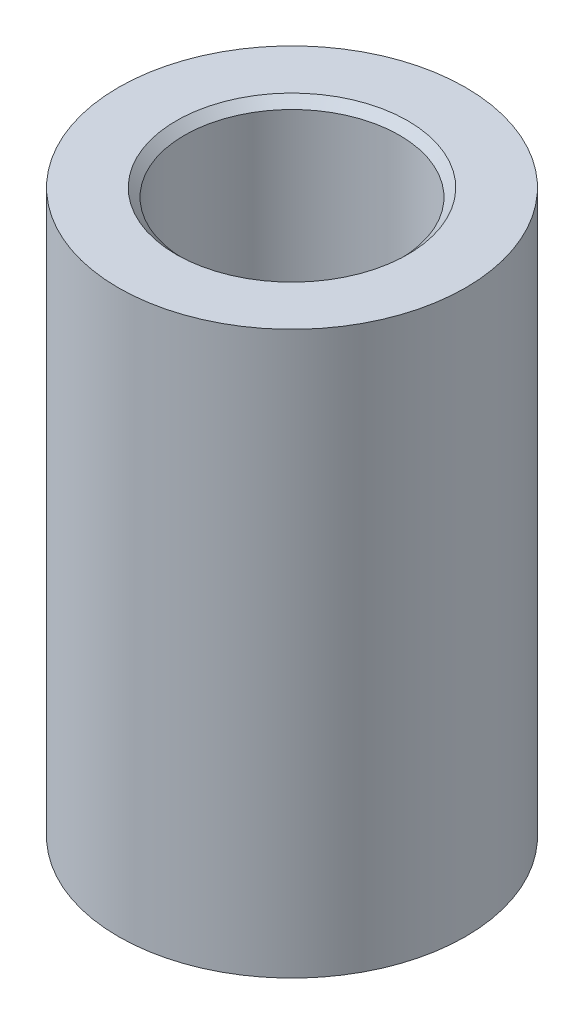
ISO-10303-21;
HEADER;
FILE_DESCRIPTION(('STEP AP214'),'2;1');
FILE_NAME('part.step','',(''),(''),'','','');
FILE_SCHEMA(('AUTOMOTIVE_DESIGN { 1 0 10303 214 1 1 1 1 }'));
ENDSEC;
DATA;
#1=APPLICATION_CONTEXT('core data for automotive mechanical design processes');
#2=APPLICATION_PROTOCOL_DEFINITION('international standard','automotive_design',2000,#1);
#3=PRODUCT_CONTEXT('',#1,'mechanical');
#4=PRODUCT('Part','Part','',(#3));
#5=PRODUCT_RELATED_PRODUCT_CATEGORY('part','',(#4));
#6=PRODUCT_DEFINITION_FORMATION('','',#4);
#7=PRODUCT_DEFINITION_CONTEXT('part definition',#1,'design');
#8=PRODUCT_DEFINITION('design','',#6,#7);
#9=PRODUCT_DEFINITION_SHAPE('','',#8);
#10=(LENGTH_UNIT() NAMED_UNIT(*) SI_UNIT(.MILLI.,.METRE.));
#11=(NAMED_UNIT(*) PLANE_ANGLE_UNIT() SI_UNIT($,.RADIAN.));
#12=(NAMED_UNIT(*) SI_UNIT($,.STERADIAN.) SOLID_ANGLE_UNIT());
#13=UNCERTAINTY_MEASURE_WITH_UNIT(LENGTH_MEASURE(1.E-05),#10,'distance_accuracy_value','');
#14=(GEOMETRIC_REPRESENTATION_CONTEXT(3) GLOBAL_UNCERTAINTY_ASSIGNED_CONTEXT((#13)) GLOBAL_UNIT_ASSIGNED_CONTEXT((#10,
#11,#12)) REPRESENTATION_CONTEXT('',''));
#15=CARTESIAN_POINT('',(0.,0.,0.));
#16=DIRECTION('',(0.,0.,1.));
#17=DIRECTION('',(1.,0.,0.));
#18=AXIS2_PLACEMENT_3D('',#15,#16,#17);
#19=CARTESIAN_POINT('',(0.,26.9875,0.));
#20=DIRECTION('',(0.,1.,0.));
#21=DIRECTION('',(0.,0.,1.));
#22=AXIS2_PLACEMENT_3D('',#19,#20,#21);
#23=PLANE('',#22);
#24=CARTESIAN_POINT('',(0.,26.9875,0.));
#25=DIRECTION('',(0.,1.,0.));
#26=DIRECTION('',(0.,0.,1.));
#27=AXIS2_PLACEMENT_3D('',#24,#25,#26);
#28=CIRCLE('',#27,5.56250000000001);
#29=CARTESIAN_POINT('',(0.,26.9875,5.56250000000001));
#30=VERTEX_POINT('',#29);
#31=EDGE_CURVE('E10',#30,#30,#28,.F.);
#32=ORIENTED_EDGE('',*,*,#31,.T.);
#33=EDGE_LOOP('',(#32));
#34=FACE_BOUND('',#33,.T.);
#35=CARTESIAN_POINT('',(0.,26.9875,0.));
#36=DIRECTION('',(0.,1.,0.));
#37=DIRECTION('',(0.,0.,1.));
#38=AXIS2_PLACEMENT_3D('',#35,#36,#37);
#39=CIRCLE('',#38,8.3375);
#40=CARTESIAN_POINT('',(0.,26.9875,8.3375));
#41=VERTEX_POINT('',#40);
#42=EDGE_CURVE('E51',#41,#41,#39,.T.);
#43=ORIENTED_EDGE('',*,*,#42,.T.);
#44=EDGE_LOOP('',(#43));
#45=FACE_BOUND('',#44,.T.);
#46=ADVANCED_FACE('F31',(#34,#45),#23,.T.);
#47=CARTESIAN_POINT('',(0.,0.,0.));
#48=DIRECTION('',(0.,1.,0.));
#49=DIRECTION('',(0.,0.,1.));
#50=AXIS2_PLACEMENT_3D('',#47,#48,#49);
#51=PLANE('',#50);
#52=CARTESIAN_POINT('',(0.,0.,0.));
#53=DIRECTION('',(0.,1.,0.));
#54=DIRECTION('',(0.,0.,1.));
#55=AXIS2_PLACEMENT_3D('',#52,#53,#54);
#56=CIRCLE('',#55,5.5625);
#57=CARTESIAN_POINT('',(0.,0.,5.5625));
#58=VERTEX_POINT('',#57);
#59=EDGE_CURVE('E46',#58,#58,#56,.T.);
#60=ORIENTED_EDGE('',*,*,#59,.T.);
#61=EDGE_LOOP('',(#60));
#62=FACE_BOUND('',#61,.T.);
#63=CARTESIAN_POINT('',(0.,0.,0.));
#64=DIRECTION('',(0.,1.,0.));
#65=DIRECTION('',(0.,0.,1.));
#66=AXIS2_PLACEMENT_3D('',#63,#64,#65);
#67=CIRCLE('',#66,8.3375);
#68=CARTESIAN_POINT('',(0.,0.,8.3375));
#69=VERTEX_POINT('',#68);
#70=EDGE_CURVE('E52',#69,#69,#67,.T.);
#71=ORIENTED_EDGE('',*,*,#70,.F.);
#72=EDGE_LOOP('',(#71));
#73=FACE_BOUND('',#72,.T.);
#74=ADVANCED_FACE('F63',(#62,#73),#51,.F.);
#75=CARTESIAN_POINT('',(0.,26.9875,0.));
#76=DIRECTION('',(0.,-1.,0.));
#77=DIRECTION('',(0.,0.,-1.));
#78=AXIS2_PLACEMENT_3D('',#75,#76,#77);
#79=CYLINDRICAL_SURFACE('',#78,8.3375);
#80=ORIENTED_EDGE('',*,*,#42,.F.);
#81=EDGE_LOOP('',(#80));
#82=FACE_BOUND('',#81,.T.);
#83=ORIENTED_EDGE('',*,*,#70,.T.);
#84=EDGE_LOOP('',(#83));
#85=FACE_BOUND('',#84,.T.);
#86=ADVANCED_FACE('F59',(#82,#85),#79,.T.);
#87=CARTESIAN_POINT('',(0.,26.9875,0.));
#88=DIRECTION('',(0.,-1.,0.));
#89=DIRECTION('',(0.,0.,-1.));
#90=AXIS2_PLACEMENT_3D('',#87,#88,#89);
#91=CYLINDRICAL_SURFACE('',#90,5.1625);
#92=CARTESIAN_POINT('',(0.,0.400000000000005,0.));
#93=DIRECTION('',(0.,1.,0.));
#94=DIRECTION('',(0.,0.,1.));
#95=AXIS2_PLACEMENT_3D('',#92,#93,#94);
#96=CIRCLE('',#95,5.1625);
#97=CARTESIAN_POINT('',(0.,0.400000000000005,5.1625));
#98=VERTEX_POINT('',#97);
#99=EDGE_CURVE('E38',#98,#98,#96,.F.);
#100=ORIENTED_EDGE('',*,*,#99,.T.);
#101=EDGE_LOOP('',(#100));
#102=FACE_BOUND('',#101,.T.);
#103=CARTESIAN_POINT('',(0.,26.5875,0.));
#104=DIRECTION('',(0.,1.,0.));
#105=DIRECTION('',(0.,0.,1.));
#106=AXIS2_PLACEMENT_3D('',#103,#104,#105);
#107=CIRCLE('',#106,5.1625);
#108=CARTESIAN_POINT('',(0.,26.5875,5.1625));
#109=VERTEX_POINT('',#108);
#110=EDGE_CURVE('E42',#109,#109,#107,.T.);
#111=ORIENTED_EDGE('',*,*,#110,.T.);
#112=EDGE_LOOP('',(#111));
#113=FACE_BOUND('',#112,.T.);
#114=ADVANCED_FACE('F62',(#102,#113),#91,.F.);
#115=CARTESIAN_POINT('',(0.,0.,0.));
#116=DIRECTION('',(0.,-1.,0.));
#117=DIRECTION('',(0.,0.,-1.));
#118=AXIS2_PLACEMENT_3D('',#115,#116,#117);
#119=CONICAL_SURFACE('',#118,5.5625,0.785398163397444);
#120=ORIENTED_EDGE('',*,*,#99,.F.);
#121=EDGE_LOOP('',(#120));
#122=FACE_BOUND('',#121,.T.);
#123=ORIENTED_EDGE('',*,*,#59,.F.);
#124=EDGE_LOOP('',(#123));
#125=FACE_BOUND('',#124,.T.);
#126=ADVANCED_FACE('F75',(#122,#125),#119,.F.);
#127=CARTESIAN_POINT('',(0.,26.5875,0.));
#128=DIRECTION('',(0.,1.,0.));
#129=DIRECTION('',(0.,0.,1.));
#130=AXIS2_PLACEMENT_3D('',#127,#128,#129);
#131=CONICAL_SURFACE('',#130,5.1625,0.785398163397448);
#132=ORIENTED_EDGE('',*,*,#31,.F.);
#133=EDGE_LOOP('',(#132));
#134=FACE_BOUND('',#133,.T.);
#135=ORIENTED_EDGE('',*,*,#110,.F.);
#136=EDGE_LOOP('',(#135));
#137=FACE_BOUND('',#136,.T.);
#138=ADVANCED_FACE('F33',(#134,#137),#131,.F.);
#139=CLOSED_SHELL('',(#46,#74,#86,#114,#126,#138));
#140=MANIFOLD_SOLID_BREP('B2',#139);
#141=ADVANCED_BREP_SHAPE_REPRESENTATION('',(#18,#140),#14);
#142=SHAPE_DEFINITION_REPRESENTATION(#9,#141);
ENDSEC;
END-ISO-10303-21;
